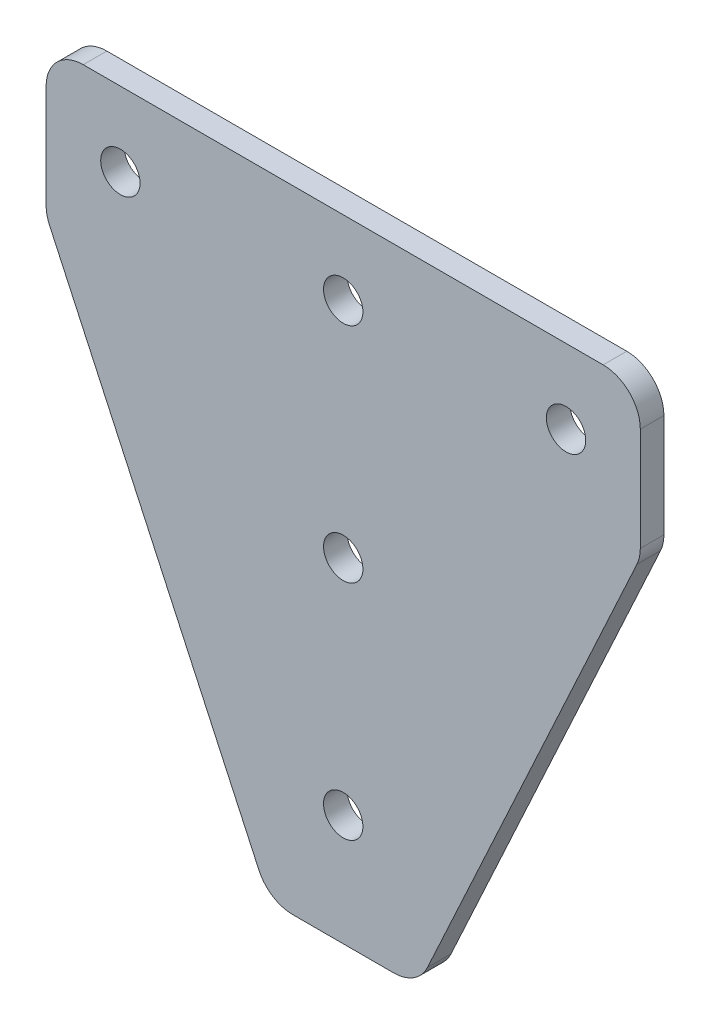
ISO-10303-21;
HEADER;
FILE_DESCRIPTION(('STEP AP214'),'2;1');
FILE_NAME('part.step','',(''),(''),'','','');
FILE_SCHEMA(('AUTOMOTIVE_DESIGN { 1 0 10303 214 1 1 1 1 }'));
ENDSEC;
DATA;
#1=APPLICATION_CONTEXT('core data for automotive mechanical design processes');
#2=APPLICATION_PROTOCOL_DEFINITION('international standard','automotive_design',2000,#1);
#3=PRODUCT_CONTEXT('',#1,'mechanical');
#4=PRODUCT('Part','Part','',(#3));
#5=PRODUCT_RELATED_PRODUCT_CATEGORY('part','',(#4));
#6=PRODUCT_DEFINITION_FORMATION('','',#4);
#7=PRODUCT_DEFINITION_CONTEXT('part definition',#1,'design');
#8=PRODUCT_DEFINITION('design','',#6,#7);
#9=PRODUCT_DEFINITION_SHAPE('','',#8);
#10=(LENGTH_UNIT() NAMED_UNIT(*) SI_UNIT(.MILLI.,.METRE.));
#11=(NAMED_UNIT(*) PLANE_ANGLE_UNIT() SI_UNIT($,.RADIAN.));
#12=(NAMED_UNIT(*) SI_UNIT($,.STERADIAN.) SOLID_ANGLE_UNIT());
#13=UNCERTAINTY_MEASURE_WITH_UNIT(LENGTH_MEASURE(1.E-05),#10,'distance_accuracy_value','');
#14=(GEOMETRIC_REPRESENTATION_CONTEXT(3) GLOBAL_UNCERTAINTY_ASSIGNED_CONTEXT((#13)) GLOBAL_UNIT_ASSIGNED_CONTEXT((#10,
#11,#12)) REPRESENTATION_CONTEXT('',''));
#15=CARTESIAN_POINT('',(0.,0.,0.));
#16=DIRECTION('',(0.,0.,1.));
#17=DIRECTION('',(1.,0.,0.));
#18=AXIS2_PLACEMENT_3D('',#15,#16,#17);
#19=CARTESIAN_POINT('',(-9.99999999999999,-85.,3.175));
#20=DIRECTION('',(0.907959384500452,0.419058177461747,0.));
#21=DIRECTION('',(-0.419058177461747,0.907959384500452,0.));
#22=AXIS2_PLACEMENT_3D('',#19,#20,#21);
#23=PLANE('',#22);
#24=DIRECTION('',(0.419058177461747,-0.907959384500451,0.));
#25=VECTOR('',#24,1.);
#26=CARTESIAN_POINT('',(-9.99999999999999,-85.,3.175));
#27=LINE('',#26,#25);
#28=CARTESIAN_POINT('',(-39.5397969225022,-20.9971066679118,3.175));
#29=VERTEX_POINT('',#28);
#30=CARTESIAN_POINT('',(-11.3406349750883,-82.0952908873087,3.175));
#31=VERTEX_POINT('',#30);
#32=EDGE_CURVE('E149',#29,#31,#27,.T.);
#33=ORIENTED_EDGE('',*,*,#32,.F.);
#34=DIRECTION('',(0.,0.,-1.));
#35=VECTOR('',#34,1.);
#36=CARTESIAN_POINT('',(-39.5397969225023,-20.9971066679118,3.175));
#37=LINE('',#36,#35);
#38=CARTESIAN_POINT('',(-39.5397969225022,-20.9971066679118,0.));
#39=VERTEX_POINT('',#38);
#40=EDGE_CURVE('E134',#29,#39,#37,.T.);
#41=ORIENTED_EDGE('',*,*,#40,.T.);
#42=DIRECTION('',(0.419058177461747,-0.907959384500451,0.));
#43=VECTOR('',#42,1.);
#44=CARTESIAN_POINT('',(-9.99999999999999,-85.,0.));
#45=LINE('',#44,#43);
#46=CARTESIAN_POINT('',(-11.3406349750883,-82.0952908873087,0.));
#47=VERTEX_POINT('',#46);
#48=EDGE_CURVE('E146',#39,#47,#45,.T.);
#49=ORIENTED_EDGE('',*,*,#48,.T.);
#50=DIRECTION('',(0.,0.,-1.));
#51=VECTOR('',#50,1.);
#52=CARTESIAN_POINT('',(-11.3406349750883,-82.0952908873087,3.175));
#53=LINE('',#52,#51);
#54=EDGE_CURVE('E151',#47,#31,#53,.F.);
#55=ORIENTED_EDGE('',*,*,#54,.T.);
#56=EDGE_LOOP('',(#33,#41,#49,#55));
#57=FACE_BOUND('',#56,.T.);
#58=ADVANCED_FACE('F40',(#57),#23,.F.);
#59=CARTESIAN_POINT('',(-9.99999999999999,-85.,3.175));
#60=DIRECTION('',(0.,1.,0.));
#61=DIRECTION('',(0.,0.,1.));
#62=AXIS2_PLACEMENT_3D('',#59,#60,#61);
#63=PLANE('',#62);
#64=DIRECTION('',(1.,0.,0.));
#65=VECTOR('',#64,1.);
#66=CARTESIAN_POINT('',(-9.99999999999999,-85.,0.));
#67=LINE('',#66,#65);
#68=CARTESIAN_POINT('',(-6.80083805258601,-85.,0.));
#69=VERTEX_POINT('',#68);
#70=CARTESIAN_POINT('',(6.80083805258603,-85.,0.));
#71=VERTEX_POINT('',#70);
#72=EDGE_CURVE('E156',#69,#71,#67,.T.);
#73=ORIENTED_EDGE('',*,*,#72,.T.);
#74=DIRECTION('',(0.,0.,-1.));
#75=VECTOR('',#74,1.);
#76=CARTESIAN_POINT('',(6.80083805258603,-85.,3.175));
#77=LINE('',#76,#75);
#78=CARTESIAN_POINT('',(6.80083805258603,-85.,3.175));
#79=VERTEX_POINT('',#78);
#80=EDGE_CURVE('E12',#71,#79,#77,.F.);
#81=ORIENTED_EDGE('',*,*,#80,.T.);
#82=DIRECTION('',(1.,0.,0.));
#83=VECTOR('',#82,1.);
#84=CARTESIAN_POINT('',(-9.99999999999999,-85.,3.175));
#85=LINE('',#84,#83);
#86=CARTESIAN_POINT('',(-6.80083805258601,-85.,3.175));
#87=VERTEX_POINT('',#86);
#88=EDGE_CURVE('E206',#87,#79,#85,.T.);
#89=ORIENTED_EDGE('',*,*,#88,.F.);
#90=DIRECTION('',(0.,0.,-1.));
#91=VECTOR('',#90,1.);
#92=CARTESIAN_POINT('',(-6.80083805258601,-85.,3.175));
#93=LINE('',#92,#91);
#94=EDGE_CURVE('E48',#87,#69,#93,.T.);
#95=ORIENTED_EDGE('',*,*,#94,.T.);
#96=EDGE_LOOP('',(#73,#81,#89,#95));
#97=FACE_BOUND('',#96,.T.);
#98=ADVANCED_FACE('F260',(#97),#63,.F.);
#99=CARTESIAN_POINT('',(10.,-85.,3.175));
#100=DIRECTION('',(-0.907959384500452,0.419058177461747,0.));
#101=DIRECTION('',(-0.419058177461747,-0.907959384500452,0.));
#102=AXIS2_PLACEMENT_3D('',#99,#100,#101);
#103=PLANE('',#102);
#104=DIRECTION('',(0.419058177461747,0.907959384500452,0.));
#105=VECTOR('',#104,1.);
#106=CARTESIAN_POINT('',(10.,-85.,0.));
#107=LINE('',#106,#105);
#108=CARTESIAN_POINT('',(11.3406349750883,-82.0952908873087,0.));
#109=VERTEX_POINT('',#108);
#110=CARTESIAN_POINT('',(39.5397969225023,-20.9971066679118,0.));
#111=VERTEX_POINT('',#110);
#112=EDGE_CURVE('E160',#109,#111,#107,.T.);
#113=ORIENTED_EDGE('',*,*,#112,.T.);
#114=DIRECTION('',(0.,0.,-1.));
#115=VECTOR('',#114,1.);
#116=CARTESIAN_POINT('',(39.5397969225023,-20.9971066679118,3.175));
#117=LINE('',#116,#115);
#118=CARTESIAN_POINT('',(39.5397969225023,-20.9971066679118,3.175));
#119=VERTEX_POINT('',#118);
#120=EDGE_CURVE('E255',#111,#119,#117,.F.);
#121=ORIENTED_EDGE('',*,*,#120,.T.);
#122=DIRECTION('',(0.419058177461747,0.907959384500452,0.));
#123=VECTOR('',#122,1.);
#124=CARTESIAN_POINT('',(10.,-85.,3.175));
#125=LINE('',#124,#123);
#126=CARTESIAN_POINT('',(11.3406349750883,-82.0952908873087,3.175));
#127=VERTEX_POINT('',#126);
#128=EDGE_CURVE('E210',#127,#119,#125,.T.);
#129=ORIENTED_EDGE('',*,*,#128,.F.);
#130=DIRECTION('',(0.,0.,-1.));
#131=VECTOR('',#130,1.);
#132=CARTESIAN_POINT('',(11.3406349750883,-82.0952908873087,3.175));
#133=LINE('',#132,#131);
#134=EDGE_CURVE('E252',#127,#109,#133,.T.);
#135=ORIENTED_EDGE('',*,*,#134,.T.);
#136=EDGE_LOOP('',(#113,#121,#129,#135));
#137=FACE_BOUND('',#136,.T.);
#138=ADVANCED_FACE('F271',(#137),#103,.F.);
#139=CARTESIAN_POINT('',(40.,-20.,3.175));
#140=DIRECTION('',(-1.,0.,0.));
#141=DIRECTION('',(0.,0.,1.));
#142=AXIS2_PLACEMENT_3D('',#139,#140,#141);
#143=PLANE('',#142);
#144=DIRECTION('',(0.,1.,0.));
#145=VECTOR('',#144,1.);
#146=CARTESIAN_POINT('',(40.,-20.,0.));
#147=LINE('',#146,#145);
#148=CARTESIAN_POINT('',(40.,-18.901815780603,0.));
#149=VERTEX_POINT('',#148);
#150=CARTESIAN_POINT('',(40.,-5.,0.));
#151=VERTEX_POINT('',#150);
#152=EDGE_CURVE('E172',#149,#151,#147,.T.);
#153=ORIENTED_EDGE('',*,*,#152,.T.);
#154=DIRECTION('',(0.,0.,-1.));
#155=VECTOR('',#154,1.);
#156=CARTESIAN_POINT('',(40.,-5.,3.175));
#157=LINE('',#156,#155);
#158=CARTESIAN_POINT('',(40.,-5.,3.175));
#159=VERTEX_POINT('',#158);
#160=EDGE_CURVE('E243',#151,#159,#157,.F.);
#161=ORIENTED_EDGE('',*,*,#160,.T.);
#162=DIRECTION('',(0.,1.,0.));
#163=VECTOR('',#162,1.);
#164=CARTESIAN_POINT('',(40.,-20.,3.175));
#165=LINE('',#164,#163);
#166=CARTESIAN_POINT('',(40.,-18.901815780603,3.175));
#167=VERTEX_POINT('',#166);
#168=EDGE_CURVE('E216',#167,#159,#165,.T.);
#169=ORIENTED_EDGE('',*,*,#168,.F.);
#170=DIRECTION('',(0.,0.,-1.));
#171=VECTOR('',#170,1.);
#172=CARTESIAN_POINT('',(40.,-18.901815780603,3.175));
#173=LINE('',#172,#171);
#174=EDGE_CURVE('E247',#167,#149,#173,.T.);
#175=ORIENTED_EDGE('',*,*,#174,.T.);
#176=EDGE_LOOP('',(#153,#161,#169,#175));
#177=FACE_BOUND('',#176,.T.);
#178=ADVANCED_FACE('F276',(#177),#143,.F.);
#179=CARTESIAN_POINT('',(40.,0.,3.175));
#180=DIRECTION('',(0.,-1.,0.));
#181=DIRECTION('',(1.,0.,0.));
#182=AXIS2_PLACEMENT_3D('',#179,#180,#181);
#183=PLANE('',#182);
#184=DIRECTION('',(-1.,0.,0.));
#185=VECTOR('',#184,1.);
#186=CARTESIAN_POINT('',(40.,0.,3.175));
#187=LINE('',#186,#185);
#188=CARTESIAN_POINT('',(35.,0.,3.175));
#189=VERTEX_POINT('',#188);
#190=CARTESIAN_POINT('',(-35.,0.,3.175));
#191=VERTEX_POINT('',#190);
#192=EDGE_CURVE('E229',#189,#191,#187,.T.);
#193=ORIENTED_EDGE('',*,*,#192,.F.);
#194=DIRECTION('',(0.,0.,-1.));
#195=VECTOR('',#194,1.);
#196=CARTESIAN_POINT('',(35.,0.,3.175));
#197=LINE('',#196,#195);
#198=CARTESIAN_POINT('',(35.,0.,0.));
#199=VERTEX_POINT('',#198);
#200=EDGE_CURVE('E245',#189,#199,#197,.T.);
#201=ORIENTED_EDGE('',*,*,#200,.T.);
#202=DIRECTION('',(-1.,0.,0.));
#203=VECTOR('',#202,1.);
#204=CARTESIAN_POINT('',(40.,0.,0.));
#205=LINE('',#204,#203);
#206=CARTESIAN_POINT('',(-35.,0.,0.));
#207=VERTEX_POINT('',#206);
#208=EDGE_CURVE('E175',#199,#207,#205,.T.);
#209=ORIENTED_EDGE('',*,*,#208,.T.);
#210=DIRECTION('',(0.,0.,-1.));
#211=VECTOR('',#210,1.);
#212=CARTESIAN_POINT('',(-35.,0.,3.175));
#213=LINE('',#212,#211);
#214=EDGE_CURVE('E55',#207,#191,#213,.F.);
#215=ORIENTED_EDGE('',*,*,#214,.T.);
#216=EDGE_LOOP('',(#193,#201,#209,#215));
#217=FACE_BOUND('',#216,.T.);
#218=ADVANCED_FACE('F277',(#217),#183,.F.);
#219=CARTESIAN_POINT('',(-40.,-20.,3.175));
#220=DIRECTION('',(1.,0.,0.));
#221=DIRECTION('',(0.,0.,-1.));
#222=AXIS2_PLACEMENT_3D('',#219,#220,#221);
#223=PLANE('',#222);
#224=DIRECTION('',(0.,-1.,0.));
#225=VECTOR('',#224,1.);
#226=CARTESIAN_POINT('',(-40.,-20.,0.));
#227=LINE('',#226,#225);
#228=CARTESIAN_POINT('',(-40.,-5.00000000000001,0.));
#229=VERTEX_POINT('',#228);
#230=CARTESIAN_POINT('',(-40.,-18.901815780603,0.));
#231=VERTEX_POINT('',#230);
#232=EDGE_CURVE('E177',#229,#231,#227,.T.);
#233=ORIENTED_EDGE('',*,*,#232,.T.);
#234=DIRECTION('',(0.,0.,-1.));
#235=VECTOR('',#234,1.);
#236=CARTESIAN_POINT('',(-40.,-18.901815780603,3.175));
#237=LINE('',#236,#235);
#238=CARTESIAN_POINT('',(-40.,-18.901815780603,3.175));
#239=VERTEX_POINT('',#238);
#240=EDGE_CURVE('E135',#231,#239,#237,.F.);
#241=ORIENTED_EDGE('',*,*,#240,.T.);
#242=DIRECTION('',(0.,-1.,0.));
#243=VECTOR('',#242,1.);
#244=CARTESIAN_POINT('',(-40.,-20.,3.175));
#245=LINE('',#244,#243);
#246=CARTESIAN_POINT('',(-40.,-5.00000000000001,3.175));
#247=VERTEX_POINT('',#246);
#248=EDGE_CURVE('E166',#247,#239,#245,.T.);
#249=ORIENTED_EDGE('',*,*,#248,.F.);
#250=DIRECTION('',(0.,0.,-1.));
#251=VECTOR('',#250,1.);
#252=CARTESIAN_POINT('',(-40.,-5.00000000000001,3.175));
#253=LINE('',#252,#251);
#254=EDGE_CURVE('E140',#247,#229,#253,.T.);
#255=ORIENTED_EDGE('',*,*,#254,.T.);
#256=EDGE_LOOP('',(#233,#241,#249,#255));
#257=FACE_BOUND('',#256,.T.);
#258=ADVANCED_FACE('F282',(#257),#223,.F.);
#259=CARTESIAN_POINT('',(0.,0.,3.175));
#260=DIRECTION('',(0.,0.,1.));
#261=DIRECTION('',(1.,0.,0.));
#262=AXIS2_PLACEMENT_3D('',#259,#260,#261);
#263=PLANE('',#262);
#264=CARTESIAN_POINT('',(-30.,-10.,3.175));
#265=DIRECTION('',(0.,0.,1.));
#266=DIRECTION('',(-1.,0.,0.));
#267=AXIS2_PLACEMENT_3D('',#264,#265,#266);
#268=CIRCLE('',#267,2.65);
#269=CARTESIAN_POINT('',(-32.65,-10.,3.175));
#270=VERTEX_POINT('',#269);
#271=EDGE_CURVE('E163',#270,#270,#268,.T.);
#272=ORIENTED_EDGE('',*,*,#271,.F.);
#273=EDGE_LOOP('',(#272));
#274=FACE_BOUND('',#273,.T.);
#275=CARTESIAN_POINT('',(0.,-10.,3.175));
#276=DIRECTION('',(0.,0.,1.));
#277=DIRECTION('',(1.,0.,0.));
#278=AXIS2_PLACEMENT_3D('',#275,#276,#277);
#279=CIRCLE('',#278,2.65);
#280=CARTESIAN_POINT('',(2.65,-10.,3.175));
#281=VERTEX_POINT('',#280);
#282=EDGE_CURVE('E446',#281,#281,#279,.T.);
#283=ORIENTED_EDGE('',*,*,#282,.F.);
#284=EDGE_LOOP('',(#283));
#285=FACE_BOUND('',#284,.T.);
#286=CARTESIAN_POINT('',(30.,-10.,3.175));
#287=DIRECTION('',(0.,0.,1.));
#288=DIRECTION('',(1.,0.,0.));
#289=AXIS2_PLACEMENT_3D('',#286,#287,#288);
#290=CIRCLE('',#289,2.65);
#291=CARTESIAN_POINT('',(32.65,-10.,3.175));
#292=VERTEX_POINT('',#291);
#293=EDGE_CURVE('E442',#292,#292,#290,.T.);
#294=ORIENTED_EDGE('',*,*,#293,.F.);
#295=EDGE_LOOP('',(#294));
#296=FACE_BOUND('',#295,.T.);
#297=CARTESIAN_POINT('',(0.,-40.,3.175));
#298=DIRECTION('',(0.,0.,1.));
#299=DIRECTION('',(1.,0.,0.));
#300=AXIS2_PLACEMENT_3D('',#297,#298,#299);
#301=CIRCLE('',#300,2.65);
#302=CARTESIAN_POINT('',(2.65,-40.,3.175));
#303=VERTEX_POINT('',#302);
#304=EDGE_CURVE('E425',#303,#303,#301,.T.);
#305=ORIENTED_EDGE('',*,*,#304,.F.);
#306=EDGE_LOOP('',(#305));
#307=FACE_BOUND('',#306,.T.);
#308=CARTESIAN_POINT('',(0.,-70.,3.175));
#309=DIRECTION('',(0.,0.,1.));
#310=DIRECTION('',(1.,0.,0.));
#311=AXIS2_PLACEMENT_3D('',#308,#309,#310);
#312=CIRCLE('',#311,2.65);
#313=CARTESIAN_POINT('',(2.65000000000001,-70.,3.175));
#314=VERTEX_POINT('',#313);
#315=EDGE_CURVE('E426',#314,#314,#312,.T.);
#316=ORIENTED_EDGE('',*,*,#315,.F.);
#317=EDGE_LOOP('',(#316));
#318=FACE_BOUND('',#317,.T.);
#319=ORIENTED_EDGE('',*,*,#248,.T.);
#320=CARTESIAN_POINT('',(-35.,-18.901815780603,3.175));
#321=DIRECTION('',(0.,0.,1.));
#322=DIRECTION('',(1.,0.,0.));
#323=AXIS2_PLACEMENT_3D('',#320,#321,#322);
#324=CIRCLE('',#323,5.);
#325=EDGE_CURVE('E226',#239,#29,#324,.T.);
#326=ORIENTED_EDGE('',*,*,#325,.T.);
#327=ORIENTED_EDGE('',*,*,#32,.T.);
#328=CARTESIAN_POINT('',(-6.80083805258601,-80.,3.175));
#329=DIRECTION('',(0.,0.,1.));
#330=DIRECTION('',(1.,0.,0.));
#331=AXIS2_PLACEMENT_3D('',#328,#329,#330);
#332=CIRCLE('',#331,5.);
#333=EDGE_CURVE('E192',#31,#87,#332,.T.);
#334=ORIENTED_EDGE('',*,*,#333,.T.);
#335=ORIENTED_EDGE('',*,*,#88,.T.);
#336=CARTESIAN_POINT('',(6.80083805258603,-80.,3.175));
#337=DIRECTION('',(0.,0.,1.));
#338=DIRECTION('',(1.,0.,0.));
#339=AXIS2_PLACEMENT_3D('',#336,#337,#338);
#340=CIRCLE('',#339,5.);
#341=EDGE_CURVE('E195',#79,#127,#340,.T.);
#342=ORIENTED_EDGE('',*,*,#341,.T.);
#343=ORIENTED_EDGE('',*,*,#128,.T.);
#344=CARTESIAN_POINT('',(35.,-18.901815780603,3.175));
#345=DIRECTION('',(0.,0.,1.));
#346=DIRECTION('',(1.,0.,0.));
#347=AXIS2_PLACEMENT_3D('',#344,#345,#346);
#348=CIRCLE('',#347,5.);
#349=EDGE_CURVE('E221',#119,#167,#348,.T.);
#350=ORIENTED_EDGE('',*,*,#349,.T.);
#351=ORIENTED_EDGE('',*,*,#168,.T.);
#352=CARTESIAN_POINT('',(35.,-5.00000000000001,3.175));
#353=DIRECTION('',(0.,0.,1.));
#354=DIRECTION('',(1.,0.,0.));
#355=AXIS2_PLACEMENT_3D('',#352,#353,#354);
#356=CIRCLE('',#355,5.);
#357=EDGE_CURVE('E62',#159,#189,#356,.T.);
#358=ORIENTED_EDGE('',*,*,#357,.T.);
#359=ORIENTED_EDGE('',*,*,#192,.T.);
#360=CARTESIAN_POINT('',(-35.,-5.00000000000001,3.175));
#361=DIRECTION('',(0.,0.,1.));
#362=DIRECTION('',(1.,0.,0.));
#363=AXIS2_PLACEMENT_3D('',#360,#361,#362);
#364=CIRCLE('',#363,5.);
#365=EDGE_CURVE('E189',#191,#247,#364,.T.);
#366=ORIENTED_EDGE('',*,*,#365,.T.);
#367=EDGE_LOOP('',(#319,#326,#327,#334,#335,#342,#343,#350,#351,#358,#359,#366));
#368=FACE_BOUND('',#367,.T.);
#369=ADVANCED_FACE('F234',(#274,#285,#296,#307,#318,#368),#263,.T.);
#370=CARTESIAN_POINT('',(0.,0.,0.));
#371=DIRECTION('',(0.,0.,1.));
#372=DIRECTION('',(1.,0.,0.));
#373=AXIS2_PLACEMENT_3D('',#370,#371,#372);
#374=PLANE('',#373);
#375=CARTESIAN_POINT('',(-30.,-10.,0.));
#376=DIRECTION('',(0.,0.,1.));
#377=DIRECTION('',(-1.,0.,0.));
#378=AXIS2_PLACEMENT_3D('',#375,#376,#377);
#379=CIRCLE('',#378,2.65);
#380=CARTESIAN_POINT('',(-32.65,-10.,0.));
#381=VERTEX_POINT('',#380);
#382=EDGE_CURVE('E157',#381,#381,#379,.T.);
#383=ORIENTED_EDGE('',*,*,#382,.T.);
#384=EDGE_LOOP('',(#383));
#385=FACE_BOUND('',#384,.T.);
#386=CARTESIAN_POINT('',(0.,-10.,0.));
#387=DIRECTION('',(0.,0.,1.));
#388=DIRECTION('',(1.,0.,0.));
#389=AXIS2_PLACEMENT_3D('',#386,#387,#388);
#390=CIRCLE('',#389,2.65);
#391=CARTESIAN_POINT('',(2.65,-10.,0.));
#392=VERTEX_POINT('',#391);
#393=EDGE_CURVE('E413',#392,#392,#390,.T.);
#394=ORIENTED_EDGE('',*,*,#393,.T.);
#395=EDGE_LOOP('',(#394));
#396=FACE_BOUND('',#395,.T.);
#397=CARTESIAN_POINT('',(30.,-10.,0.));
#398=DIRECTION('',(0.,0.,1.));
#399=DIRECTION('',(1.,0.,0.));
#400=AXIS2_PLACEMENT_3D('',#397,#398,#399);
#401=CIRCLE('',#400,2.65);
#402=CARTESIAN_POINT('',(32.65,-10.,0.));
#403=VERTEX_POINT('',#402);
#404=EDGE_CURVE('E417',#403,#403,#401,.T.);
#405=ORIENTED_EDGE('',*,*,#404,.T.);
#406=EDGE_LOOP('',(#405));
#407=FACE_BOUND('',#406,.T.);
#408=CARTESIAN_POINT('',(0.,-40.,0.));
#409=DIRECTION('',(0.,0.,1.));
#410=DIRECTION('',(1.,0.,0.));
#411=AXIS2_PLACEMENT_3D('',#408,#409,#410);
#412=CIRCLE('',#411,2.65);
#413=CARTESIAN_POINT('',(2.65,-40.,0.));
#414=VERTEX_POINT('',#413);
#415=EDGE_CURVE('E421',#414,#414,#412,.T.);
#416=ORIENTED_EDGE('',*,*,#415,.T.);
#417=EDGE_LOOP('',(#416));
#418=FACE_BOUND('',#417,.T.);
#419=CARTESIAN_POINT('',(0.,-70.,0.));
#420=DIRECTION('',(0.,0.,1.));
#421=DIRECTION('',(1.,0.,0.));
#422=AXIS2_PLACEMENT_3D('',#419,#420,#421);
#423=CIRCLE('',#422,2.65);
#424=CARTESIAN_POINT('',(2.65000000000001,-70.,0.));
#425=VERTEX_POINT('',#424);
#426=EDGE_CURVE('E424',#425,#425,#423,.T.);
#427=ORIENTED_EDGE('',*,*,#426,.T.);
#428=EDGE_LOOP('',(#427));
#429=FACE_BOUND('',#428,.T.);
#430=ORIENTED_EDGE('',*,*,#48,.F.);
#431=CARTESIAN_POINT('',(-35.,-18.901815780603,0.));
#432=DIRECTION('',(0.,0.,1.));
#433=DIRECTION('',(1.,0.,0.));
#434=AXIS2_PLACEMENT_3D('',#431,#432,#433);
#435=CIRCLE('',#434,5.);
#436=EDGE_CURVE('E130',#39,#231,#435,.F.);
#437=ORIENTED_EDGE('',*,*,#436,.T.);
#438=ORIENTED_EDGE('',*,*,#232,.F.);
#439=CARTESIAN_POINT('',(-35.,-5.00000000000001,0.));
#440=DIRECTION('',(0.,0.,1.));
#441=DIRECTION('',(1.,0.,0.));
#442=AXIS2_PLACEMENT_3D('',#439,#440,#441);
#443=CIRCLE('',#442,5.);
#444=EDGE_CURVE('E150',#229,#207,#443,.F.);
#445=ORIENTED_EDGE('',*,*,#444,.T.);
#446=ORIENTED_EDGE('',*,*,#208,.F.);
#447=CARTESIAN_POINT('',(35.,-5.00000000000001,0.));
#448=DIRECTION('',(0.,0.,1.));
#449=DIRECTION('',(1.,0.,0.));
#450=AXIS2_PLACEMENT_3D('',#447,#448,#449);
#451=CIRCLE('',#450,5.);
#452=EDGE_CURVE('E141',#199,#151,#451,.F.);
#453=ORIENTED_EDGE('',*,*,#452,.T.);
#454=ORIENTED_EDGE('',*,*,#152,.F.);
#455=CARTESIAN_POINT('',(35.,-18.901815780603,0.));
#456=DIRECTION('',(0.,0.,1.));
#457=DIRECTION('',(1.,0.,0.));
#458=AXIS2_PLACEMENT_3D('',#455,#456,#457);
#459=CIRCLE('',#458,5.);
#460=EDGE_CURVE('E184',#149,#111,#459,.F.);
#461=ORIENTED_EDGE('',*,*,#460,.T.);
#462=ORIENTED_EDGE('',*,*,#112,.F.);
#463=CARTESIAN_POINT('',(6.80083805258603,-80.,0.));
#464=DIRECTION('',(0.,0.,1.));
#465=DIRECTION('',(1.,0.,0.));
#466=AXIS2_PLACEMENT_3D('',#463,#464,#465);
#467=CIRCLE('',#466,5.);
#468=EDGE_CURVE('E182',#109,#71,#467,.F.);
#469=ORIENTED_EDGE('',*,*,#468,.T.);
#470=ORIENTED_EDGE('',*,*,#72,.F.);
#471=CARTESIAN_POINT('',(-6.80083805258601,-80.,0.));
#472=DIRECTION('',(0.,0.,1.));
#473=DIRECTION('',(1.,0.,0.));
#474=AXIS2_PLACEMENT_3D('',#471,#472,#473);
#475=CIRCLE('',#474,5.);
#476=EDGE_CURVE('E155',#69,#47,#475,.F.);
#477=ORIENTED_EDGE('',*,*,#476,.T.);
#478=EDGE_LOOP('',(#430,#437,#438,#445,#446,#453,#454,#461,#462,#469,#470,#477));
#479=FACE_BOUND('',#478,.T.);
#480=ADVANCED_FACE('F153',(#385,#396,#407,#418,#429,#479),#374,.F.);
#481=CARTESIAN_POINT('',(0.,-70.,0.));
#482=DIRECTION('',(0.,0.,1.));
#483=DIRECTION('',(1.,0.,0.));
#484=AXIS2_PLACEMENT_3D('',#481,#482,#483);
#485=CYLINDRICAL_SURFACE('',#484,2.65);
#486=ORIENTED_EDGE('',*,*,#426,.F.);
#487=EDGE_LOOP('',(#486));
#488=FACE_BOUND('',#487,.T.);
#489=ORIENTED_EDGE('',*,*,#315,.T.);
#490=EDGE_LOOP('',(#489));
#491=FACE_BOUND('',#490,.T.);
#492=ADVANCED_FACE('F366',(#488,#491),#485,.F.);
#493=CARTESIAN_POINT('',(0.,-40.,0.));
#494=DIRECTION('',(0.,0.,1.));
#495=DIRECTION('',(1.,0.,0.));
#496=AXIS2_PLACEMENT_3D('',#493,#494,#495);
#497=CYLINDRICAL_SURFACE('',#496,2.65);
#498=ORIENTED_EDGE('',*,*,#415,.F.);
#499=EDGE_LOOP('',(#498));
#500=FACE_BOUND('',#499,.T.);
#501=ORIENTED_EDGE('',*,*,#304,.T.);
#502=EDGE_LOOP('',(#501));
#503=FACE_BOUND('',#502,.T.);
#504=ADVANCED_FACE('F358',(#500,#503),#497,.F.);
#505=CARTESIAN_POINT('',(30.,-10.,0.));
#506=DIRECTION('',(0.,0.,1.));
#507=DIRECTION('',(1.,0.,0.));
#508=AXIS2_PLACEMENT_3D('',#505,#506,#507);
#509=CYLINDRICAL_SURFACE('',#508,2.65);
#510=ORIENTED_EDGE('',*,*,#404,.F.);
#511=EDGE_LOOP('',(#510));
#512=FACE_BOUND('',#511,.T.);
#513=ORIENTED_EDGE('',*,*,#293,.T.);
#514=EDGE_LOOP('',(#513));
#515=FACE_BOUND('',#514,.T.);
#516=ADVANCED_FACE('F350',(#512,#515),#509,.F.);
#517=CARTESIAN_POINT('',(0.,-10.,0.));
#518=DIRECTION('',(0.,0.,1.));
#519=DIRECTION('',(1.,0.,0.));
#520=AXIS2_PLACEMENT_3D('',#517,#518,#519);
#521=CYLINDRICAL_SURFACE('',#520,2.65);
#522=ORIENTED_EDGE('',*,*,#393,.F.);
#523=EDGE_LOOP('',(#522));
#524=FACE_BOUND('',#523,.T.);
#525=ORIENTED_EDGE('',*,*,#282,.T.);
#526=EDGE_LOOP('',(#525));
#527=FACE_BOUND('',#526,.T.);
#528=ADVANCED_FACE('F342',(#524,#527),#521,.F.);
#529=CARTESIAN_POINT('',(-30.,-10.,0.));
#530=DIRECTION('',(0.,0.,1.));
#531=DIRECTION('',(1.,0.,0.));
#532=AXIS2_PLACEMENT_3D('',#529,#530,#531);
#533=CYLINDRICAL_SURFACE('',#532,2.65);
#534=ORIENTED_EDGE('',*,*,#382,.F.);
#535=EDGE_LOOP('',(#534));
#536=FACE_BOUND('',#535,.T.);
#537=ORIENTED_EDGE('',*,*,#271,.T.);
#538=EDGE_LOOP('',(#537));
#539=FACE_BOUND('',#538,.T.);
#540=ADVANCED_FACE('F304',(#536,#539),#533,.F.);
#541=CARTESIAN_POINT('',(-35.,-18.901815780603,3.175));
#542=DIRECTION('',(0.,0.,-1.));
#543=DIRECTION('',(-1.,0.,0.));
#544=AXIS2_PLACEMENT_3D('',#541,#542,#543);
#545=CYLINDRICAL_SURFACE('',#544,5.);
#546=ORIENTED_EDGE('',*,*,#325,.F.);
#547=ORIENTED_EDGE('',*,*,#240,.F.);
#548=ORIENTED_EDGE('',*,*,#436,.F.);
#549=ORIENTED_EDGE('',*,*,#40,.F.);
#550=EDGE_LOOP('',(#546,#547,#548,#549));
#551=FACE_BOUND('',#550,.T.);
#552=ADVANCED_FACE('F133',(#551),#545,.T.);
#553=CARTESIAN_POINT('',(35.,-5.00000000000001,3.175));
#554=DIRECTION('',(0.,0.,-1.));
#555=DIRECTION('',(-1.,0.,0.));
#556=AXIS2_PLACEMENT_3D('',#553,#554,#555);
#557=CYLINDRICAL_SURFACE('',#556,5.);
#558=ORIENTED_EDGE('',*,*,#357,.F.);
#559=ORIENTED_EDGE('',*,*,#160,.F.);
#560=ORIENTED_EDGE('',*,*,#452,.F.);
#561=ORIENTED_EDGE('',*,*,#200,.F.);
#562=EDGE_LOOP('',(#558,#559,#560,#561));
#563=FACE_BOUND('',#562,.T.);
#564=ADVANCED_FACE('F242',(#563),#557,.T.);
#565=CARTESIAN_POINT('',(35.,-18.901815780603,3.175));
#566=DIRECTION('',(0.,0.,-1.));
#567=DIRECTION('',(-1.,0.,0.));
#568=AXIS2_PLACEMENT_3D('',#565,#566,#567);
#569=CYLINDRICAL_SURFACE('',#568,5.);
#570=ORIENTED_EDGE('',*,*,#349,.F.);
#571=ORIENTED_EDGE('',*,*,#120,.F.);
#572=ORIENTED_EDGE('',*,*,#460,.F.);
#573=ORIENTED_EDGE('',*,*,#174,.F.);
#574=EDGE_LOOP('',(#570,#571,#572,#573));
#575=FACE_BOUND('',#574,.T.);
#576=ADVANCED_FACE('F274',(#575),#569,.T.);
#577=CARTESIAN_POINT('',(6.80083805258603,-80.,3.175));
#578=DIRECTION('',(0.,0.,-1.));
#579=DIRECTION('',(-1.,0.,0.));
#580=AXIS2_PLACEMENT_3D('',#577,#578,#579);
#581=CYLINDRICAL_SURFACE('',#580,5.);
#582=ORIENTED_EDGE('',*,*,#341,.F.);
#583=ORIENTED_EDGE('',*,*,#80,.F.);
#584=ORIENTED_EDGE('',*,*,#468,.F.);
#585=ORIENTED_EDGE('',*,*,#134,.F.);
#586=EDGE_LOOP('',(#582,#583,#584,#585));
#587=FACE_BOUND('',#586,.T.);
#588=ADVANCED_FACE('F268',(#587),#581,.T.);
#589=CARTESIAN_POINT('',(-6.80083805258601,-80.,3.175));
#590=DIRECTION('',(0.,0.,-1.));
#591=DIRECTION('',(-1.,0.,0.));
#592=AXIS2_PLACEMENT_3D('',#589,#590,#591);
#593=CYLINDRICAL_SURFACE('',#592,5.);
#594=ORIENTED_EDGE('',*,*,#333,.F.);
#595=ORIENTED_EDGE('',*,*,#54,.F.);
#596=ORIENTED_EDGE('',*,*,#476,.F.);
#597=ORIENTED_EDGE('',*,*,#94,.F.);
#598=EDGE_LOOP('',(#594,#595,#596,#597));
#599=FACE_BOUND('',#598,.T.);
#600=ADVANCED_FACE('F310',(#599),#593,.T.);
#601=CARTESIAN_POINT('',(-35.,-5.00000000000001,3.175));
#602=DIRECTION('',(0.,0.,-1.));
#603=DIRECTION('',(-1.,0.,0.));
#604=AXIS2_PLACEMENT_3D('',#601,#602,#603);
#605=CYLINDRICAL_SURFACE('',#604,5.);
#606=ORIENTED_EDGE('',*,*,#365,.F.);
#607=ORIENTED_EDGE('',*,*,#214,.F.);
#608=ORIENTED_EDGE('',*,*,#444,.F.);
#609=ORIENTED_EDGE('',*,*,#254,.F.);
#610=EDGE_LOOP('',(#606,#607,#608,#609));
#611=FACE_BOUND('',#610,.T.);
#612=ADVANCED_FACE('F42',(#611),#605,.T.);
#613=CLOSED_SHELL('',(#58,#98,#138,#178,#218,#258,#369,#480,#492,#504,#516,#528,#540,#552,#564,
#576,#588,#600,#612));
#614=MANIFOLD_SOLID_BREP('B2',#613);
#615=ADVANCED_BREP_SHAPE_REPRESENTATION('',(#18,#614),#14);
#616=SHAPE_DEFINITION_REPRESENTATION(#9,#615);
ENDSEC;
END-ISO-10303-21;
